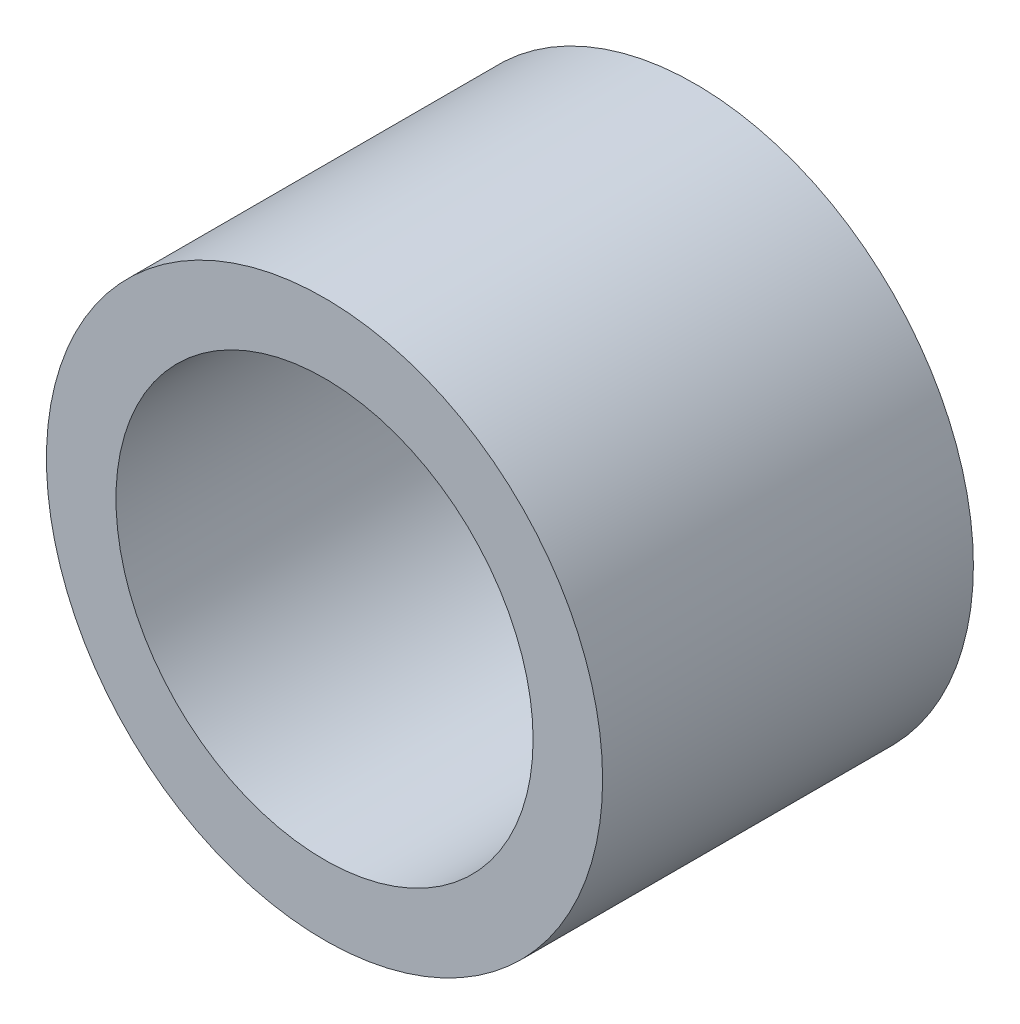
ISO-10303-21;
HEADER;
FILE_DESCRIPTION(('STEP AP214'),'2;1');
FILE_NAME('part.step','',(''),(''),'','','');
FILE_SCHEMA(('AUTOMOTIVE_DESIGN { 1 0 10303 214 1 1 1 1 }'));
ENDSEC;
DATA;
#1=APPLICATION_CONTEXT('core data for automotive mechanical design processes');
#2=APPLICATION_PROTOCOL_DEFINITION('international standard','automotive_design',2000,#1);
#3=PRODUCT_CONTEXT('',#1,'mechanical');
#4=PRODUCT('Part','Part','',(#3));
#5=PRODUCT_RELATED_PRODUCT_CATEGORY('part','',(#4));
#6=PRODUCT_DEFINITION_FORMATION('','',#4);
#7=PRODUCT_DEFINITION_CONTEXT('part definition',#1,'design');
#8=PRODUCT_DEFINITION('design','',#6,#7);
#9=PRODUCT_DEFINITION_SHAPE('','',#8);
#10=(LENGTH_UNIT() NAMED_UNIT(*) SI_UNIT(.MILLI.,.METRE.));
#11=(NAMED_UNIT(*) PLANE_ANGLE_UNIT() SI_UNIT($,.RADIAN.));
#12=(NAMED_UNIT(*) SI_UNIT($,.STERADIAN.) SOLID_ANGLE_UNIT());
#13=UNCERTAINTY_MEASURE_WITH_UNIT(LENGTH_MEASURE(1.E-05),#10,'distance_accuracy_value','');
#14=(GEOMETRIC_REPRESENTATION_CONTEXT(3) GLOBAL_UNCERTAINTY_ASSIGNED_CONTEXT((#13)) GLOBAL_UNIT_ASSIGNED_CONTEXT((#10,
#11,#12)) REPRESENTATION_CONTEXT('',''));
#15=CARTESIAN_POINT('',(0.,0.,0.));
#16=DIRECTION('',(0.,0.,1.));
#17=DIRECTION('',(1.,0.,0.));
#18=AXIS2_PLACEMENT_3D('',#15,#16,#17);
#19=CARTESIAN_POINT('',(0.,0.,4.));
#20=DIRECTION('',(0.,0.,1.));
#21=DIRECTION('',(1.,0.,0.));
#22=AXIS2_PLACEMENT_3D('',#19,#20,#21);
#23=PLANE('',#22);
#24=CARTESIAN_POINT('',(0.,0.,4.));
#25=DIRECTION('',(0.,0.,1.));
#26=DIRECTION('',(1.,0.,0.));
#27=AXIS2_PLACEMENT_3D('',#24,#25,#26);
#28=CIRCLE('',#27,6.);
#29=CARTESIAN_POINT('',(6.,0.,4.));
#30=VERTEX_POINT('',#29);
#31=EDGE_CURVE('E10',#30,#30,#28,.T.);
#32=ORIENTED_EDGE('',*,*,#31,.T.);
#33=EDGE_LOOP('',(#32));
#34=FACE_BOUND('',#33,.T.);
#35=CARTESIAN_POINT('',(0.,0.,4.));
#36=DIRECTION('',(0.,0.,1.));
#37=DIRECTION('',(1.,0.,0.));
#38=AXIS2_PLACEMENT_3D('',#35,#36,#37);
#39=CIRCLE('',#38,4.5);
#40=CARTESIAN_POINT('',(4.5,0.,4.));
#41=VERTEX_POINT('',#40);
#42=EDGE_CURVE('E50',#41,#41,#39,.T.);
#43=ORIENTED_EDGE('',*,*,#42,.F.);
#44=EDGE_LOOP('',(#43));
#45=FACE_BOUND('',#44,.T.);
#46=ADVANCED_FACE('F37',(#34,#45),#23,.T.);
#47=CARTESIAN_POINT('',(0.,0.,-4.));
#48=DIRECTION('',(0.,0.,1.));
#49=DIRECTION('',(1.,0.,0.));
#50=AXIS2_PLACEMENT_3D('',#47,#48,#49);
#51=PLANE('',#50);
#52=CARTESIAN_POINT('',(0.,0.,-4.));
#53=DIRECTION('',(0.,0.,1.));
#54=DIRECTION('',(1.,0.,0.));
#55=AXIS2_PLACEMENT_3D('',#52,#53,#54);
#56=CIRCLE('',#55,6.);
#57=CARTESIAN_POINT('',(6.,0.,-4.));
#58=VERTEX_POINT('',#57);
#59=EDGE_CURVE('E41',#58,#58,#56,.T.);
#60=ORIENTED_EDGE('',*,*,#59,.F.);
#61=EDGE_LOOP('',(#60));
#62=FACE_BOUND('',#61,.T.);
#63=CARTESIAN_POINT('',(0.,0.,-4.));
#64=DIRECTION('',(0.,0.,1.));
#65=DIRECTION('',(1.,0.,0.));
#66=AXIS2_PLACEMENT_3D('',#63,#64,#65);
#67=CIRCLE('',#66,4.5);
#68=CARTESIAN_POINT('',(4.5,0.,-4.));
#69=VERTEX_POINT('',#68);
#70=EDGE_CURVE('E52',#69,#69,#67,.T.);
#71=ORIENTED_EDGE('',*,*,#70,.T.);
#72=EDGE_LOOP('',(#71));
#73=FACE_BOUND('',#72,.T.);
#74=ADVANCED_FACE('F64',(#62,#73),#51,.F.);
#75=CARTESIAN_POINT('',(0.,0.,4.));
#76=DIRECTION('',(0.,0.,-1.));
#77=DIRECTION('',(-1.,0.,0.));
#78=AXIS2_PLACEMENT_3D('',#75,#76,#77);
#79=CYLINDRICAL_SURFACE('',#78,6.);
#80=ORIENTED_EDGE('',*,*,#31,.F.);
#81=EDGE_LOOP('',(#80));
#82=FACE_BOUND('',#81,.T.);
#83=ORIENTED_EDGE('',*,*,#59,.T.);
#84=EDGE_LOOP('',(#83));
#85=FACE_BOUND('',#84,.T.);
#86=ADVANCED_FACE('F39',(#82,#85),#79,.T.);
#87=CARTESIAN_POINT('',(0.,0.,4.));
#88=DIRECTION('',(0.,0.,-1.));
#89=DIRECTION('',(-1.,0.,0.));
#90=AXIS2_PLACEMENT_3D('',#87,#88,#89);
#91=CYLINDRICAL_SURFACE('',#90,4.5);
#92=ORIENTED_EDGE('',*,*,#42,.T.);
#93=EDGE_LOOP('',(#92));
#94=FACE_BOUND('',#93,.T.);
#95=ORIENTED_EDGE('',*,*,#70,.F.);
#96=EDGE_LOOP('',(#95));
#97=FACE_BOUND('',#96,.T.);
#98=ADVANCED_FACE('F60',(#94,#97),#91,.F.);
#99=CLOSED_SHELL('',(#46,#74,#86,#98));
#100=MANIFOLD_SOLID_BREP('B2',#99);
#101=ADVANCED_BREP_SHAPE_REPRESENTATION('',(#18,#100),#14);
#102=SHAPE_DEFINITION_REPRESENTATION(#9,#101);
ENDSEC;
END-ISO-10303-21;
